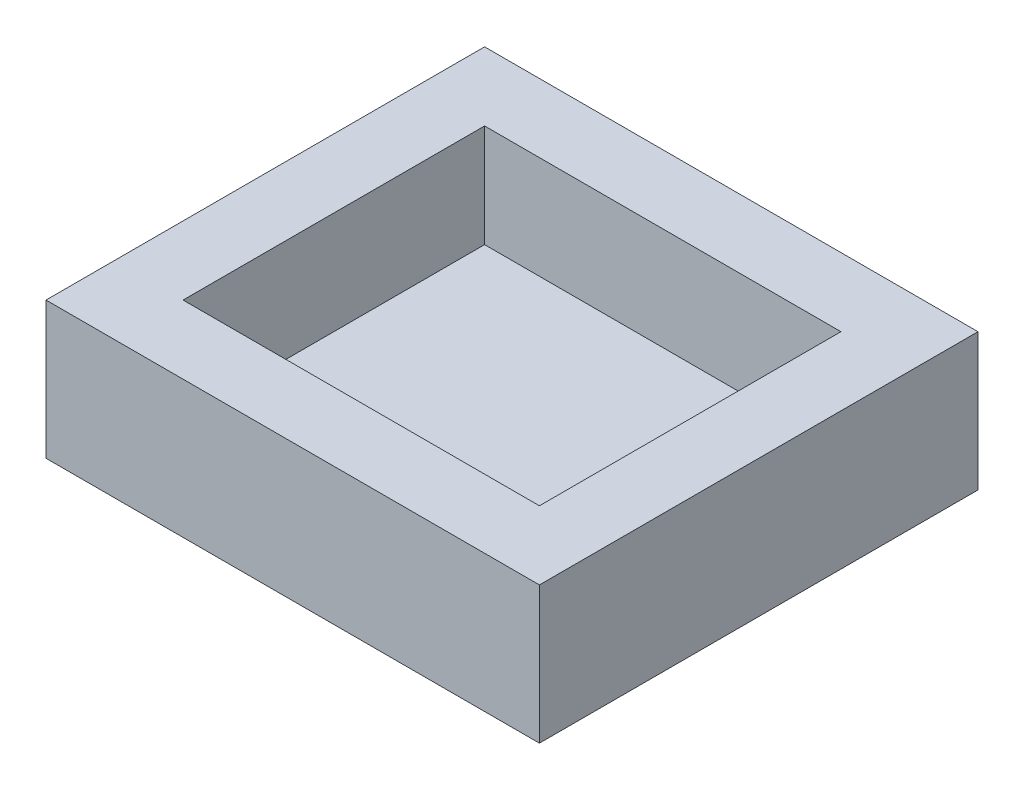
ISO-10303-21;
HEADER;
FILE_DESCRIPTION(('STEP AP214'),'2;1');
FILE_NAME('part.step','',(''),(''),'','','');
FILE_SCHEMA(('AUTOMOTIVE_DESIGN { 1 0 10303 214 1 1 1 1 }'));
ENDSEC;
DATA;
#1=APPLICATION_CONTEXT('core data for automotive mechanical design processes');
#2=APPLICATION_PROTOCOL_DEFINITION('international standard','automotive_design',2000,#1);
#3=PRODUCT_CONTEXT('',#1,'mechanical');
#4=PRODUCT('Part','Part','',(#3));
#5=PRODUCT_RELATED_PRODUCT_CATEGORY('part','',(#4));
#6=PRODUCT_DEFINITION_FORMATION('','',#4);
#7=PRODUCT_DEFINITION_CONTEXT('part definition',#1,'design');
#8=PRODUCT_DEFINITION('design','',#6,#7);
#9=PRODUCT_DEFINITION_SHAPE('','',#8);
#10=(LENGTH_UNIT() NAMED_UNIT(*) SI_UNIT(.MILLI.,.METRE.));
#11=(NAMED_UNIT(*) PLANE_ANGLE_UNIT() SI_UNIT($,.RADIAN.));
#12=(NAMED_UNIT(*) SI_UNIT($,.STERADIAN.) SOLID_ANGLE_UNIT());
#13=UNCERTAINTY_MEASURE_WITH_UNIT(LENGTH_MEASURE(1.E-05),#10,'distance_accuracy_value','');
#14=(GEOMETRIC_REPRESENTATION_CONTEXT(3) GLOBAL_UNCERTAINTY_ASSIGNED_CONTEXT((#13)) GLOBAL_UNIT_ASSIGNED_CONTEXT((#10,
#11,#12)) REPRESENTATION_CONTEXT('',''));
#15=CARTESIAN_POINT('',(0.,0.,0.));
#16=DIRECTION('',(0.,0.,1.));
#17=DIRECTION('',(1.,0.,0.));
#18=AXIS2_PLACEMENT_3D('',#15,#16,#17);
#19=CARTESIAN_POINT('',(22.86,12.7,20.32));
#20=DIRECTION('',(-1.,0.,0.));
#21=DIRECTION('',(0.,0.,1.));
#22=AXIS2_PLACEMENT_3D('',#19,#20,#21);
#23=PLANE('',#22);
#24=DIRECTION('',(0.,0.,-1.));
#25=VECTOR('',#24,1.);
#26=CARTESIAN_POINT('',(22.86,0.,20.32));
#27=LINE('',#26,#25);
#28=CARTESIAN_POINT('',(22.86,0.,20.32));
#29=VERTEX_POINT('',#28);
#30=CARTESIAN_POINT('',(22.86,0.,-20.32));
#31=VERTEX_POINT('',#30);
#32=EDGE_CURVE('E162',#29,#31,#27,.T.);
#33=ORIENTED_EDGE('',*,*,#32,.T.);
#34=DIRECTION('',(0.,-1.,0.));
#35=VECTOR('',#34,1.);
#36=CARTESIAN_POINT('',(22.86,12.7,-20.32));
#37=LINE('',#36,#35);
#38=CARTESIAN_POINT('',(22.86,12.7,-20.32));
#39=VERTEX_POINT('',#38);
#40=EDGE_CURVE('E11',#39,#31,#37,.T.);
#41=ORIENTED_EDGE('',*,*,#40,.F.);
#42=DIRECTION('',(0.,0.,-1.));
#43=VECTOR('',#42,1.);
#44=CARTESIAN_POINT('',(22.86,12.7,20.32));
#45=LINE('',#44,#43);
#46=CARTESIAN_POINT('',(22.86,12.7,20.32));
#47=VERTEX_POINT('',#46);
#48=EDGE_CURVE('E168',#47,#39,#45,.T.);
#49=ORIENTED_EDGE('',*,*,#48,.F.);
#50=DIRECTION('',(0.,-1.,0.));
#51=VECTOR('',#50,1.);
#52=CARTESIAN_POINT('',(22.86,12.7,20.32));
#53=LINE('',#52,#51);
#54=EDGE_CURVE('E178',#47,#29,#53,.T.);
#55=ORIENTED_EDGE('',*,*,#54,.T.);
#56=EDGE_LOOP('',(#33,#41,#49,#55));
#57=FACE_BOUND('',#56,.T.);
#58=ADVANCED_FACE('F43',(#57),#23,.F.);
#59=CARTESIAN_POINT('',(-22.86,12.7,-20.32));
#60=DIRECTION('',(0.,0.,1.));
#61=DIRECTION('',(1.,0.,0.));
#62=AXIS2_PLACEMENT_3D('',#59,#60,#61);
#63=PLANE('',#62);
#64=DIRECTION('',(-1.,0.,0.));
#65=VECTOR('',#64,1.);
#66=CARTESIAN_POINT('',(-22.86,0.,-20.32));
#67=LINE('',#66,#65);
#68=CARTESIAN_POINT('',(-22.86,0.,-20.32));
#69=VERTEX_POINT('',#68);
#70=EDGE_CURVE('E182',#31,#69,#67,.T.);
#71=ORIENTED_EDGE('',*,*,#70,.T.);
#72=DIRECTION('',(0.,-1.,0.));
#73=VECTOR('',#72,1.);
#74=CARTESIAN_POINT('',(-22.86,12.7,-20.32));
#75=LINE('',#74,#73);
#76=CARTESIAN_POINT('',(-22.86,12.7,-20.32));
#77=VERTEX_POINT('',#76);
#78=EDGE_CURVE('E51',#77,#69,#75,.T.);
#79=ORIENTED_EDGE('',*,*,#78,.F.);
#80=DIRECTION('',(-1.,0.,0.));
#81=VECTOR('',#80,1.);
#82=CARTESIAN_POINT('',(-22.86,12.7,-20.32));
#83=LINE('',#82,#81);
#84=EDGE_CURVE('E95',#39,#77,#83,.T.);
#85=ORIENTED_EDGE('',*,*,#84,.F.);
#86=ORIENTED_EDGE('',*,*,#40,.T.);
#87=EDGE_LOOP('',(#71,#79,#85,#86));
#88=FACE_BOUND('',#87,.T.);
#89=ADVANCED_FACE('F217',(#88),#63,.F.);
#90=CARTESIAN_POINT('',(-22.86,12.7,20.32));
#91=DIRECTION('',(1.,0.,0.));
#92=DIRECTION('',(0.,0.,-1.));
#93=AXIS2_PLACEMENT_3D('',#90,#91,#92);
#94=PLANE('',#93);
#95=DIRECTION('',(0.,0.,1.));
#96=VECTOR('',#95,1.);
#97=CARTESIAN_POINT('',(-22.86,0.,20.32));
#98=LINE('',#97,#96);
#99=CARTESIAN_POINT('',(-22.86,0.,20.32));
#100=VERTEX_POINT('',#99);
#101=EDGE_CURVE('E185',#69,#100,#98,.T.);
#102=ORIENTED_EDGE('',*,*,#101,.T.);
#103=DIRECTION('',(0.,-1.,0.));
#104=VECTOR('',#103,1.);
#105=CARTESIAN_POINT('',(-22.86,12.7,20.32));
#106=LINE('',#105,#104);
#107=CARTESIAN_POINT('',(-22.86,12.7,20.32));
#108=VERTEX_POINT('',#107);
#109=EDGE_CURVE('E192',#108,#100,#106,.T.);
#110=ORIENTED_EDGE('',*,*,#109,.F.);
#111=DIRECTION('',(0.,0.,1.));
#112=VECTOR('',#111,1.);
#113=CARTESIAN_POINT('',(-22.86,12.7,20.32));
#114=LINE('',#113,#112);
#115=EDGE_CURVE('E173',#77,#108,#114,.T.);
#116=ORIENTED_EDGE('',*,*,#115,.F.);
#117=ORIENTED_EDGE('',*,*,#78,.T.);
#118=EDGE_LOOP('',(#102,#110,#116,#117));
#119=FACE_BOUND('',#118,.T.);
#120=ADVANCED_FACE('F199',(#119),#94,.F.);
#121=CARTESIAN_POINT('',(-22.86,12.7,20.32));
#122=DIRECTION('',(0.,0.,-1.));
#123=DIRECTION('',(-1.,0.,0.));
#124=AXIS2_PLACEMENT_3D('',#121,#122,#123);
#125=PLANE('',#124);
#126=DIRECTION('',(1.,0.,0.));
#127=VECTOR('',#126,1.);
#128=CARTESIAN_POINT('',(-22.86,0.,20.32));
#129=LINE('',#128,#127);
#130=EDGE_CURVE('E88',#100,#29,#129,.T.);
#131=ORIENTED_EDGE('',*,*,#130,.T.);
#132=ORIENTED_EDGE('',*,*,#54,.F.);
#133=DIRECTION('',(1.,0.,0.));
#134=VECTOR('',#133,1.);
#135=CARTESIAN_POINT('',(-22.86,12.7,20.32));
#136=LINE('',#135,#134);
#137=EDGE_CURVE('E67',#108,#47,#136,.T.);
#138=ORIENTED_EDGE('',*,*,#137,.F.);
#139=ORIENTED_EDGE('',*,*,#109,.T.);
#140=EDGE_LOOP('',(#131,#132,#138,#139));
#141=FACE_BOUND('',#140,.T.);
#142=ADVANCED_FACE('F207',(#141),#125,.F.);
#143=CARTESIAN_POINT('',(0.,12.7,0.));
#144=DIRECTION('',(0.,-1.,0.));
#145=DIRECTION('',(0.,0.,-1.));
#146=AXIS2_PLACEMENT_3D('',#143,#144,#145);
#147=PLANE('',#146);
#148=DIRECTION('',(-1.,0.,0.));
#149=VECTOR('',#148,1.);
#150=CARTESIAN_POINT('',(-16.51,12.7,-13.97));
#151=LINE('',#150,#149);
#152=CARTESIAN_POINT('',(16.51,12.7,-13.97));
#153=VERTEX_POINT('',#152);
#154=CARTESIAN_POINT('',(-16.51,12.7,-13.97));
#155=VERTEX_POINT('',#154);
#156=EDGE_CURVE('E153',#153,#155,#151,.T.);
#157=ORIENTED_EDGE('',*,*,#156,.F.);
#158=DIRECTION('',(0.,0.,-1.));
#159=VECTOR('',#158,1.);
#160=CARTESIAN_POINT('',(16.51,12.7,13.97));
#161=LINE('',#160,#159);
#162=CARTESIAN_POINT('',(16.51,12.7,13.97));
#163=VERTEX_POINT('',#162);
#164=EDGE_CURVE('E58',#163,#153,#161,.T.);
#165=ORIENTED_EDGE('',*,*,#164,.F.);
#166=DIRECTION('',(1.,0.,0.));
#167=VECTOR('',#166,1.);
#168=CARTESIAN_POINT('',(-16.51,12.7,13.97));
#169=LINE('',#168,#167);
#170=CARTESIAN_POINT('',(-16.51,12.7,13.97));
#171=VERTEX_POINT('',#170);
#172=EDGE_CURVE('E140',#171,#163,#169,.T.);
#173=ORIENTED_EDGE('',*,*,#172,.F.);
#174=DIRECTION('',(0.,0.,1.));
#175=VECTOR('',#174,1.);
#176=CARTESIAN_POINT('',(-16.51,12.7,13.97));
#177=LINE('',#176,#175);
#178=EDGE_CURVE('E144',#155,#171,#177,.T.);
#179=ORIENTED_EDGE('',*,*,#178,.F.);
#180=EDGE_LOOP('',(#157,#165,#173,#179));
#181=FACE_BOUND('',#180,.T.);
#182=ORIENTED_EDGE('',*,*,#48,.T.);
#183=ORIENTED_EDGE('',*,*,#84,.T.);
#184=ORIENTED_EDGE('',*,*,#115,.T.);
#185=ORIENTED_EDGE('',*,*,#137,.T.);
#186=EDGE_LOOP('',(#182,#183,#184,#185));
#187=FACE_BOUND('',#186,.T.);
#188=ADVANCED_FACE('F209',(#181,#187),#147,.F.);
#189=CARTESIAN_POINT('',(0.,0.,0.));
#190=DIRECTION('',(0.,-1.,0.));
#191=DIRECTION('',(0.,0.,-1.));
#192=AXIS2_PLACEMENT_3D('',#189,#190,#191);
#193=PLANE('',#192);
#194=ORIENTED_EDGE('',*,*,#32,.F.);
#195=ORIENTED_EDGE('',*,*,#130,.F.);
#196=ORIENTED_EDGE('',*,*,#101,.F.);
#197=ORIENTED_EDGE('',*,*,#70,.F.);
#198=EDGE_LOOP('',(#194,#195,#196,#197));
#199=FACE_BOUND('',#198,.T.);
#200=ADVANCED_FACE('F203',(#199),#193,.T.);
#201=CARTESIAN_POINT('',(16.51,3.175,13.97));
#202=DIRECTION('',(1.,0.,0.));
#203=DIRECTION('',(0.,0.,-1.));
#204=AXIS2_PLACEMENT_3D('',#201,#202,#203);
#205=PLANE('',#204);
#206=ORIENTED_EDGE('',*,*,#164,.T.);
#207=DIRECTION('',(0.,1.,0.));
#208=VECTOR('',#207,1.);
#209=CARTESIAN_POINT('',(16.51,3.175,-13.97));
#210=LINE('',#209,#208);
#211=CARTESIAN_POINT('',(16.51,3.175,-13.97));
#212=VERTEX_POINT('',#211);
#213=EDGE_CURVE('E115',#212,#153,#210,.T.);
#214=ORIENTED_EDGE('',*,*,#213,.F.);
#215=DIRECTION('',(0.,0.,-1.));
#216=VECTOR('',#215,1.);
#217=CARTESIAN_POINT('',(16.51,3.175,13.97));
#218=LINE('',#217,#216);
#219=CARTESIAN_POINT('',(16.51,3.175,13.97));
#220=VERTEX_POINT('',#219);
#221=EDGE_CURVE('E119',#220,#212,#218,.T.);
#222=ORIENTED_EDGE('',*,*,#221,.F.);
#223=DIRECTION('',(0.,1.,0.));
#224=VECTOR('',#223,1.);
#225=CARTESIAN_POINT('',(16.51,3.175,13.97));
#226=LINE('',#225,#224);
#227=EDGE_CURVE('E159',#220,#163,#226,.T.);
#228=ORIENTED_EDGE('',*,*,#227,.T.);
#229=EDGE_LOOP('',(#206,#214,#222,#228));
#230=FACE_BOUND('',#229,.T.);
#231=ADVANCED_FACE('F117',(#230),#205,.F.);
#232=CARTESIAN_POINT('',(-16.51,3.175,13.97));
#233=DIRECTION('',(0.,0.,1.));
#234=DIRECTION('',(1.,0.,0.));
#235=AXIS2_PLACEMENT_3D('',#232,#233,#234);
#236=PLANE('',#235);
#237=ORIENTED_EDGE('',*,*,#172,.T.);
#238=ORIENTED_EDGE('',*,*,#227,.F.);
#239=DIRECTION('',(1.,0.,0.));
#240=VECTOR('',#239,1.);
#241=CARTESIAN_POINT('',(-16.51,3.175,13.97));
#242=LINE('',#241,#240);
#243=CARTESIAN_POINT('',(-16.51,3.175,13.97));
#244=VERTEX_POINT('',#243);
#245=EDGE_CURVE('E126',#244,#220,#242,.T.);
#246=ORIENTED_EDGE('',*,*,#245,.F.);
#247=DIRECTION('',(0.,1.,0.));
#248=VECTOR('',#247,1.);
#249=CARTESIAN_POINT('',(-16.51,3.175,13.97));
#250=LINE('',#249,#248);
#251=EDGE_CURVE('E163',#244,#171,#250,.T.);
#252=ORIENTED_EDGE('',*,*,#251,.T.);
#253=EDGE_LOOP('',(#237,#238,#246,#252));
#254=FACE_BOUND('',#253,.T.);
#255=ADVANCED_FACE('F260',(#254),#236,.F.);
#256=CARTESIAN_POINT('',(-16.51,3.175,13.97));
#257=DIRECTION('',(-1.,0.,0.));
#258=DIRECTION('',(0.,0.,1.));
#259=AXIS2_PLACEMENT_3D('',#256,#257,#258);
#260=PLANE('',#259);
#261=ORIENTED_EDGE('',*,*,#178,.T.);
#262=ORIENTED_EDGE('',*,*,#251,.F.);
#263=DIRECTION('',(0.,0.,1.));
#264=VECTOR('',#263,1.);
#265=CARTESIAN_POINT('',(-16.51,3.175,13.97));
#266=LINE('',#265,#264);
#267=CARTESIAN_POINT('',(-16.51,3.175,-13.97));
#268=VERTEX_POINT('',#267);
#269=EDGE_CURVE('E135',#268,#244,#266,.T.);
#270=ORIENTED_EDGE('',*,*,#269,.F.);
#271=DIRECTION('',(0.,1.,0.));
#272=VECTOR('',#271,1.);
#273=CARTESIAN_POINT('',(-16.51,3.175,-13.97));
#274=LINE('',#273,#272);
#275=EDGE_CURVE('E125',#268,#155,#274,.T.);
#276=ORIENTED_EDGE('',*,*,#275,.T.);
#277=EDGE_LOOP('',(#261,#262,#270,#276));
#278=FACE_BOUND('',#277,.T.);
#279=ADVANCED_FACE('F270',(#278),#260,.F.);
#280=CARTESIAN_POINT('',(-16.51,3.175,-13.97));
#281=DIRECTION('',(0.,0.,-1.));
#282=DIRECTION('',(-1.,0.,0.));
#283=AXIS2_PLACEMENT_3D('',#280,#281,#282);
#284=PLANE('',#283);
#285=ORIENTED_EDGE('',*,*,#156,.T.);
#286=ORIENTED_EDGE('',*,*,#275,.F.);
#287=DIRECTION('',(-1.,0.,0.));
#288=VECTOR('',#287,1.);
#289=CARTESIAN_POINT('',(-16.51,3.175,-13.97));
#290=LINE('',#289,#288);
#291=EDGE_CURVE('E129',#212,#268,#290,.T.);
#292=ORIENTED_EDGE('',*,*,#291,.F.);
#293=ORIENTED_EDGE('',*,*,#213,.T.);
#294=EDGE_LOOP('',(#285,#286,#292,#293));
#295=FACE_BOUND('',#294,.T.);
#296=ADVANCED_FACE('F130',(#295),#284,.F.);
#297=CARTESIAN_POINT('',(0.,3.175,0.));
#298=DIRECTION('',(0.,-1.,0.));
#299=DIRECTION('',(0.,0.,-1.));
#300=AXIS2_PLACEMENT_3D('',#297,#298,#299);
#301=PLANE('',#300);
#302=ORIENTED_EDGE('',*,*,#221,.T.);
#303=ORIENTED_EDGE('',*,*,#291,.T.);
#304=ORIENTED_EDGE('',*,*,#269,.T.);
#305=ORIENTED_EDGE('',*,*,#245,.T.);
#306=EDGE_LOOP('',(#302,#303,#304,#305));
#307=FACE_BOUND('',#306,.T.);
#308=ADVANCED_FACE('F137',(#307),#301,.F.);
#309=CLOSED_SHELL('',(#58,#89,#120,#142,#188,#200,#231,#255,#279,#296,#308));
#310=MANIFOLD_SOLID_BREP('B2',#309);
#311=ADVANCED_BREP_SHAPE_REPRESENTATION('',(#18,#310),#14);
#312=SHAPE_DEFINITION_REPRESENTATION(#9,#311);
ENDSEC;
END-ISO-10303-21;
